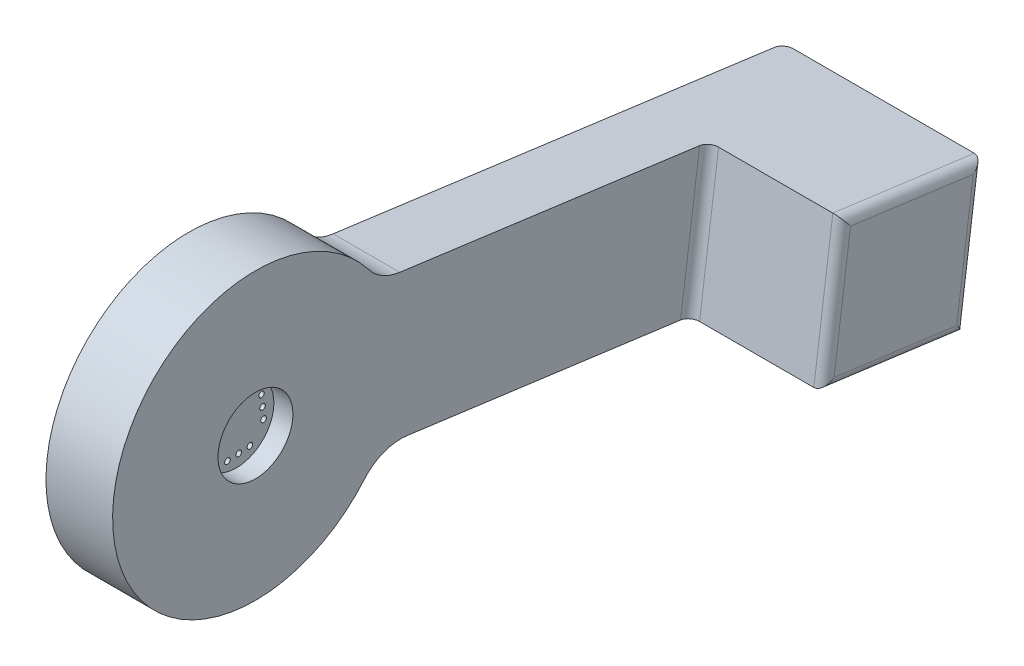
ISO-10303-21;
HEADER;
FILE_DESCRIPTION(('STEP AP214'),'2;1');
FILE_NAME('part.step','',(''),(''),'','','');
FILE_SCHEMA(('AUTOMOTIVE_DESIGN { 1 0 10303 214 1 1 1 1 }'));
ENDSEC;
DATA;
#1=APPLICATION_CONTEXT('core data for automotive mechanical design processes');
#2=APPLICATION_PROTOCOL_DEFINITION('international standard','automotive_design',2000,#1);
#3=PRODUCT_CONTEXT('',#1,'mechanical');
#4=PRODUCT('Part','Part','',(#3));
#5=PRODUCT_RELATED_PRODUCT_CATEGORY('part','',(#4));
#6=PRODUCT_DEFINITION_FORMATION('','',#4);
#7=PRODUCT_DEFINITION_CONTEXT('part definition',#1,'design');
#8=PRODUCT_DEFINITION('design','',#6,#7);
#9=PRODUCT_DEFINITION_SHAPE('','',#8);
#10=(LENGTH_UNIT() NAMED_UNIT(*) SI_UNIT(.MILLI.,.METRE.));
#11=(NAMED_UNIT(*) PLANE_ANGLE_UNIT() SI_UNIT($,.RADIAN.));
#12=(NAMED_UNIT(*) SI_UNIT($,.STERADIAN.) SOLID_ANGLE_UNIT());
#13=UNCERTAINTY_MEASURE_WITH_UNIT(LENGTH_MEASURE(1.E-05),#10,'distance_accuracy_value','');
#14=(GEOMETRIC_REPRESENTATION_CONTEXT(3) GLOBAL_UNCERTAINTY_ASSIGNED_CONTEXT((#13)) GLOBAL_UNIT_ASSIGNED_CONTEXT((#10,
#11,#12)) REPRESENTATION_CONTEXT('',''));
#15=CARTESIAN_POINT('',(0.,0.,0.));
#16=DIRECTION('',(0.,0.,1.));
#17=DIRECTION('',(1.,0.,0.));
#18=AXIS2_PLACEMENT_3D('',#15,#16,#17);
#19=CARTESIAN_POINT('',(17.78,-35.4166303814402,-153.708015152707));
#20=DIRECTION('',(0.,0.132873129837206,0.991133054320794));
#21=DIRECTION('',(0.,-0.991133054320794,0.132873129837206));
#22=AXIS2_PLACEMENT_3D('',#19,#20,#21);
#23=PLANE('',#22);
#24=DIRECTION('',(1.,0.,0.));
#25=VECTOR('',#24,1.);
#26=CARTESIAN_POINT('',(47.3438395307718,-6.59150776262857,-157.572364387763));
#27=LINE('',#26,#25);
#28=CARTESIAN_POINT('',(6.19583953077183,-6.59150776262856,-157.572364387763));
#29=VERTEX_POINT('',#28);
#30=CARTESIAN_POINT('',(47.3438395307718,-6.59150776262857,-157.572364387763));
#31=VERTEX_POINT('',#30);
#32=EDGE_CURVE('E190',#29,#31,#27,.T.);
#33=ORIENTED_EDGE('',*,*,#32,.F.);
#34=DIRECTION('',(0.,0.991133054320794,-0.132873129837205));
#35=VECTOR('',#34,1.);
#36=CARTESIAN_POINT('',(6.19583953077183,-26.4795836306296,-154.906132164449));
#37=LINE('',#36,#35);
#38=CARTESIAN_POINT('',(6.19583953077183,-26.4795836306296,-154.906132164449));
#39=VERTEX_POINT('',#38);
#40=EDGE_CURVE('E164',#39,#29,#37,.T.);
#41=ORIENTED_EDGE('',*,*,#40,.F.);
#42=DIRECTION('',(-1.,0.,0.));
#43=VECTOR('',#42,1.);
#44=CARTESIAN_POINT('',(47.3438395307718,-26.4795836306296,-154.906132164449));
#45=LINE('',#44,#43);
#46=CARTESIAN_POINT('',(47.3438395307718,-26.4795836306296,-154.906132164449));
#47=VERTEX_POINT('',#46);
#48=EDGE_CURVE('E181',#47,#39,#45,.T.);
#49=ORIENTED_EDGE('',*,*,#48,.F.);
#50=DIRECTION('',(0.,-0.991133054320794,0.132873129837205));
#51=VECTOR('',#50,1.);
#52=CARTESIAN_POINT('',(47.3438395307718,-26.4795836306296,-154.906132164449));
#53=LINE('',#52,#51);
#54=EDGE_CURVE('E184',#31,#47,#53,.T.);
#55=ORIENTED_EDGE('',*,*,#54,.F.);
#56=EDGE_LOOP('',(#33,#41,#49,#55));
#57=FACE_BOUND('',#56,.T.);
#58=DIRECTION('',(-1.,0.,0.));
#59=VECTOR('',#58,1.);
#60=CARTESIAN_POINT('',(17.78,-35.4166303814402,-153.708015152707));
#61=LINE('',#60,#59);
#62=CARTESIAN_POINT('',(50.8,-35.4166303814402,-153.708015152707));
#63=VERTEX_POINT('',#62);
#64=CARTESIAN_POINT('',(2.54,-35.4166303814402,-153.708015152707));
#65=VERTEX_POINT('',#64);
#66=EDGE_CURVE('E291',#63,#65,#61,.T.);
#67=ORIENTED_EDGE('',*,*,#66,.T.);
#68=DIRECTION('',(0.,0.991133054320794,-0.132873129837206));
#69=VECTOR('',#68,1.);
#70=CARTESIAN_POINT('',(2.54,-35.4166303814402,-153.708015152707));
#71=LINE('',#70,#69);
#72=CARTESIAN_POINT('',(2.54,2.34553898818202,-158.770481399505));
#73=VERTEX_POINT('',#72);
#74=EDGE_CURVE('E331',#65,#73,#71,.T.);
#75=ORIENTED_EDGE('',*,*,#74,.T.);
#76=DIRECTION('',(-1.,0.,0.));
#77=VECTOR('',#76,1.);
#78=CARTESIAN_POINT('',(17.78,2.34553898818202,-158.770481399505));
#79=LINE('',#78,#77);
#80=CARTESIAN_POINT('',(50.8,2.34553898818202,-158.770481399505));
#81=VERTEX_POINT('',#80);
#82=EDGE_CURVE('E299',#81,#73,#79,.T.);
#83=ORIENTED_EDGE('',*,*,#82,.F.);
#84=DIRECTION('',(0.,0.991133054320794,-0.132873129837206));
#85=VECTOR('',#84,1.);
#86=CARTESIAN_POINT('',(50.8,-35.4166303814402,-153.708015152707));
#87=LINE('',#86,#85);
#88=EDGE_CURVE('E322',#81,#63,#87,.F.);
#89=ORIENTED_EDGE('',*,*,#88,.T.);
#90=EDGE_LOOP('',(#67,#75,#83,#89));
#91=FACE_BOUND('',#90,.T.);
#92=ADVANCED_FACE('F44',(#57,#91),#23,.F.);
#93=CARTESIAN_POINT('',(17.78,2.34553898818202,-158.770481399505));
#94=DIRECTION('',(0.,-0.991133054320793,0.132873129837206));
#95=DIRECTION('',(0.,-0.132873129837206,-0.991133054320793));
#96=AXIS2_PLACEMENT_3D('',#93,#94,#95);
#97=PLANE('',#96);
#98=DIRECTION('',(0.,0.132873129837206,0.991133054320793));
#99=VECTOR('',#98,1.);
#100=CARTESIAN_POINT('',(0.,2.34553898818202,-158.770481399505));
#101=LINE('',#100,#99);
#102=CARTESIAN_POINT('',(0.,2.68303673796853,-156.25300344153));
#103=VERTEX_POINT('',#102);
#104=CARTESIAN_POINT('',(0.,18.4671894912832,-38.5151617317301));
#105=VERTEX_POINT('',#104);
#106=EDGE_CURVE('E280',#103,#105,#101,.T.);
#107=ORIENTED_EDGE('',*,*,#106,.T.);
#108=DIRECTION('',(1.,0.,0.));
#109=VECTOR('',#108,1.);
#110=CARTESIAN_POINT('',(17.78,18.4671894912832,-38.5151617317301));
#111=LINE('',#110,#109);
#112=CARTESIAN_POINT('',(17.78,18.4671894912832,-38.5151617317301));
#113=VERTEX_POINT('',#112);
#114=EDGE_CURVE('E59',#105,#113,#111,.T.);
#115=ORIENTED_EDGE('',*,*,#114,.T.);
#116=DIRECTION('',(0.,0.132873129837206,0.991133054320793));
#117=VECTOR('',#116,1.);
#118=CARTESIAN_POINT('',(17.78,2.34553898818202,-158.770481399505));
#119=LINE('',#118,#117);
#120=CARTESIAN_POINT('',(17.78,7.74550298476609,-118.490834071908));
#121=VERTEX_POINT('',#120);
#122=EDGE_CURVE('E283',#121,#113,#119,.T.);
#123=ORIENTED_EDGE('',*,*,#122,.F.);
#124=CARTESIAN_POINT('',(20.32,7.74550298476609,-118.490834071908));
#125=DIRECTION('',(0.,-0.991133054320793,0.132873129837206));
#126=DIRECTION('',(0.,-0.132873129837206,-0.991133054320793));
#127=AXIS2_PLACEMENT_3D('',#124,#125,#126);
#128=CIRCLE('',#127,2.54);
#129=CARTESIAN_POINT('',(20.32,7.40800523497956,-121.008312029883));
#130=VERTEX_POINT('',#129);
#131=EDGE_CURVE('E310',#121,#130,#128,.T.);
#132=ORIENTED_EDGE('',*,*,#131,.T.);
#133=DIRECTION('',(-1.,0.,0.));
#134=VECTOR('',#133,1.);
#135=CARTESIAN_POINT('',(53.34,7.40800523497956,-121.008312029883));
#136=LINE('',#135,#134);
#137=CARTESIAN_POINT('',(50.8,7.40800523497956,-121.008312029883));
#138=VERTEX_POINT('',#137);
#139=EDGE_CURVE('E202',#138,#130,#136,.T.);
#140=ORIENTED_EDGE('',*,*,#139,.F.);
#141=DIRECTION('',(0.,0.132873129837206,0.991133054320793));
#142=VECTOR('',#141,1.);
#143=CARTESIAN_POINT('',(50.8,2.34553898818202,-158.770481399505));
#144=LINE('',#143,#142);
#145=EDGE_CURVE('E329',#138,#81,#144,.F.);
#146=ORIENTED_EDGE('',*,*,#145,.T.);
#147=ORIENTED_EDGE('',*,*,#82,.T.);
#148=CARTESIAN_POINT('',(2.54,2.68303673796853,-156.25300344153));
#149=DIRECTION('',(0.,-0.991133054320793,0.132873129837206));
#150=DIRECTION('',(0.,-0.132873129837206,-0.991133054320793));
#151=AXIS2_PLACEMENT_3D('',#148,#149,#150);
#152=CIRCLE('',#151,2.54);
#153=EDGE_CURVE('E343',#73,#103,#152,.F.);
#154=ORIENTED_EDGE('',*,*,#153,.T.);
#155=EDGE_LOOP('',(#107,#115,#123,#132,#140,#146,#147,#154));
#156=FACE_BOUND('',#155,.T.);
#157=ADVANCED_FACE('F384',(#156),#97,.F.);
#158=CARTESIAN_POINT('',(17.78,0.,0.));
#159=DIRECTION('',(-1.,0.,0.));
#160=DIRECTION('',(0.,0.,1.));
#161=AXIS2_PLACEMENT_3D('',#158,#159,#160);
#162=CYLINDRICAL_SURFACE('',#161,38.1);
#163=CARTESIAN_POINT('',(0.,0.,0.));
#164=DIRECTION('',(1.,0.,0.));
#165=DIRECTION('',(0.,0.,-1.));
#166=AXIS2_PLACEMENT_3D('',#163,#164,#165);
#167=CIRCLE('',#166,38.1);
#168=CARTESIAN_POINT('',(0.,23.2909344608679,-30.1519878604969));
#169=VERTEX_POINT('',#168);
#170=CARTESIAN_POINT('',(0.,-24.6164097690644,-29.0799307097096));
#171=VERTEX_POINT('',#170);
#172=EDGE_CURVE('E293',#169,#171,#167,.T.);
#173=ORIENTED_EDGE('',*,*,#172,.T.);
#174=DIRECTION('',(-1.,0.,0.));
#175=VECTOR('',#174,1.);
#176=CARTESIAN_POINT('',(17.78,-24.6164097690644,-29.0799307097096));
#177=LINE('',#176,#175);
#178=CARTESIAN_POINT('',(17.78,-24.6164097690644,-29.0799307097096));
#179=VERTEX_POINT('',#178);
#180=EDGE_CURVE('E356',#171,#179,#177,.F.);
#181=ORIENTED_EDGE('',*,*,#180,.T.);
#182=CARTESIAN_POINT('',(17.78,0.,0.));
#183=DIRECTION('',(1.,0.,0.));
#184=DIRECTION('',(0.,0.,-1.));
#185=AXIS2_PLACEMENT_3D('',#182,#183,#184);
#186=CIRCLE('',#185,38.1);
#187=CARTESIAN_POINT('',(17.78,23.2909344608679,-30.1519878604969));
#188=VERTEX_POINT('',#187);
#189=EDGE_CURVE('E285',#188,#179,#186,.T.);
#190=ORIENTED_EDGE('',*,*,#189,.F.);
#191=DIRECTION('',(-1.,0.,0.));
#192=VECTOR('',#191,1.);
#193=CARTESIAN_POINT('',(17.78,23.2909344608679,-30.1519878604969));
#194=LINE('',#193,#192);
#195=EDGE_CURVE('E353',#188,#169,#194,.T.);
#196=ORIENTED_EDGE('',*,*,#195,.T.);
#197=EDGE_LOOP('',(#173,#181,#190,#196));
#198=FACE_BOUND('',#197,.T.);
#199=ADVANCED_FACE('F379',(#198),#162,.T.);
#200=CARTESIAN_POINT('',(17.78,-19.2204264775072,-32.896583500764));
#201=DIRECTION('',(0.,0.991133054320793,-0.132873129837206));
#202=DIRECTION('',(0.,0.132873129837206,0.991133054320794));
#203=AXIS2_PLACEMENT_3D('',#200,#201,#202);
#204=PLANE('',#203);
#205=DIRECTION('',(0.,-0.132873129837206,-0.991133054320793));
#206=VECTOR('',#205,1.);
#207=CARTESIAN_POINT('',(17.78,-19.2204264775072,-32.896583500764));
#208=LINE('',#207,#206);
#209=CARTESIAN_POINT('',(17.78,-20.2344899022118,-40.4607296952119));
#210=VERTEX_POINT('',#209);
#211=CARTESIAN_POINT('',(17.78,-30.0166663848561,-113.42836782511));
#212=VERTEX_POINT('',#211);
#213=EDGE_CURVE('E289',#210,#212,#208,.T.);
#214=ORIENTED_EDGE('',*,*,#213,.F.);
#215=DIRECTION('',(1.,0.,0.));
#216=VECTOR('',#215,1.);
#217=CARTESIAN_POINT('',(0.,-20.2344899022118,-40.4607296952119));
#218=LINE('',#217,#216);
#219=CARTESIAN_POINT('',(0.,-20.2344899022118,-40.4607296952119));
#220=VERTEX_POINT('',#219);
#221=EDGE_CURVE('E350',#210,#220,#218,.F.);
#222=ORIENTED_EDGE('',*,*,#221,.T.);
#223=DIRECTION('',(0.,-0.132873129837206,-0.991133054320793));
#224=VECTOR('',#223,1.);
#225=CARTESIAN_POINT('',(0.,-19.2204264775072,-32.896583500764));
#226=LINE('',#225,#224);
#227=CARTESIAN_POINT('',(0.,-35.0791326316537,-151.190537194732));
#228=VERTEX_POINT('',#227);
#229=EDGE_CURVE('E286',#220,#228,#226,.T.);
#230=ORIENTED_EDGE('',*,*,#229,.T.);
#231=CARTESIAN_POINT('',(2.54,-35.0791326316537,-151.190537194732));
#232=DIRECTION('',(0.,0.991133054320793,-0.132873129837206));
#233=DIRECTION('',(0.,0.132873129837206,0.991133054320794));
#234=AXIS2_PLACEMENT_3D('',#231,#232,#233);
#235=CIRCLE('',#234,2.54);
#236=EDGE_CURVE('E348',#228,#65,#235,.F.);
#237=ORIENTED_EDGE('',*,*,#236,.T.);
#238=ORIENTED_EDGE('',*,*,#66,.F.);
#239=DIRECTION('',(0.,-0.132873129837206,-0.991133054320794));
#240=VECTOR('',#239,1.);
#241=CARTESIAN_POINT('',(50.8,-30.3541641346426,-115.945845783085));
#242=LINE('',#241,#240);
#243=CARTESIAN_POINT('',(50.8,-30.3541641346427,-115.945845783085));
#244=VERTEX_POINT('',#243);
#245=EDGE_CURVE('E325',#63,#244,#242,.F.);
#246=ORIENTED_EDGE('',*,*,#245,.T.);
#247=DIRECTION('',(-1.,0.,0.));
#248=VECTOR('',#247,1.);
#249=CARTESIAN_POINT('',(53.34,-30.3541641346427,-115.945845783085));
#250=LINE('',#249,#248);
#251=CARTESIAN_POINT('',(20.32,-30.3541641346427,-115.945845783085));
#252=VERTEX_POINT('',#251);
#253=EDGE_CURVE('E197',#244,#252,#250,.T.);
#254=ORIENTED_EDGE('',*,*,#253,.T.);
#255=CARTESIAN_POINT('',(20.32,-30.0166663848561,-113.42836782511));
#256=DIRECTION('',(0.,0.991133054320793,-0.132873129837206));
#257=DIRECTION('',(0.,0.132873129837206,0.991133054320794));
#258=AXIS2_PLACEMENT_3D('',#255,#256,#257);
#259=CIRCLE('',#258,2.54);
#260=EDGE_CURVE('E307',#252,#212,#259,.T.);
#261=ORIENTED_EDGE('',*,*,#260,.T.);
#262=EDGE_LOOP('',(#214,#222,#230,#237,#238,#246,#254,#261));
#263=FACE_BOUND('',#262,.T.);
#264=ADVANCED_FACE('F372',(#263),#204,.F.);
#265=CARTESIAN_POINT('',(17.78,0.,0.));
#266=DIRECTION('',(1.,0.,0.));
#267=DIRECTION('',(0.,0.,-1.));
#268=AXIS2_PLACEMENT_3D('',#265,#266,#267);
#269=PLANE('',#268);
#270=ORIENTED_EDGE('',*,*,#189,.T.);
#271=CARTESIAN_POINT('',(17.78,-32.8218796920859,-38.7732409462794));
#272=DIRECTION('',(1.,0.,0.));
#273=DIRECTION('',(0.,0.,-1.));
#274=AXIS2_PLACEMENT_3D('',#271,#272,#273);
#275=CIRCLE('',#274,12.7);
#276=EDGE_CURVE('E361',#179,#210,#275,.F.);
#277=ORIENTED_EDGE('',*,*,#276,.T.);
#278=ORIENTED_EDGE('',*,*,#213,.T.);
#279=DIRECTION('',(0.,-0.991133054320794,0.132873129837206));
#280=VECTOR('',#279,1.);
#281=CARTESIAN_POINT('',(17.78,-15.4678956526637,-115.378802929704));
#282=LINE('',#281,#280);
#283=EDGE_CURVE('E305',#212,#121,#282,.F.);
#284=ORIENTED_EDGE('',*,*,#283,.T.);
#285=ORIENTED_EDGE('',*,*,#122,.T.);
#286=CARTESIAN_POINT('',(17.78,31.0545792811572,-40.2026504806626));
#287=DIRECTION('',(1.,0.,0.));
#288=DIRECTION('',(0.,0.,-1.));
#289=AXIS2_PLACEMENT_3D('',#286,#287,#288);
#290=CIRCLE('',#289,12.7);
#291=EDGE_CURVE('E11',#113,#188,#290,.F.);
#292=ORIENTED_EDGE('',*,*,#291,.T.);
#293=EDGE_LOOP('',(#270,#277,#278,#284,#285,#292));
#294=FACE_BOUND('',#293,.T.);
#295=CARTESIAN_POINT('',(17.78,0.,0.));
#296=DIRECTION('',(1.,0.,0.));
#297=DIRECTION('',(0.,0.,-1.));
#298=AXIS2_PLACEMENT_3D('',#295,#296,#297);
#299=CIRCLE('',#298,10.);
#300=CARTESIAN_POINT('',(17.78,0.,-10.));
#301=VERTEX_POINT('',#300);
#302=EDGE_CURVE('E274',#301,#301,#299,.T.);
#303=ORIENTED_EDGE('',*,*,#302,.F.);
#304=EDGE_LOOP('',(#303));
#305=FACE_BOUND('',#304,.T.);
#306=ADVANCED_FACE('F365',(#294,#305),#269,.T.);
#307=CARTESIAN_POINT('',(0.,0.,0.));
#308=DIRECTION('',(1.,0.,0.));
#309=DIRECTION('',(0.,0.,-1.));
#310=AXIS2_PLACEMENT_3D('',#307,#308,#309);
#311=PLANE('',#310);
#312=ORIENTED_EDGE('',*,*,#106,.F.);
#313=DIRECTION('',(0.,0.991133054320794,-0.132873129837206));
#314=VECTOR('',#313,1.);
#315=CARTESIAN_POINT('',(0.,-20.5303618994613,-153.140972299326));
#316=LINE('',#315,#314);
#317=EDGE_CURVE('E345',#103,#228,#316,.F.);
#318=ORIENTED_EDGE('',*,*,#317,.T.);
#319=ORIENTED_EDGE('',*,*,#229,.F.);
#320=CARTESIAN_POINT('',(0.,-32.8218796920859,-38.7732409462794));
#321=DIRECTION('',(1.,0.,0.));
#322=DIRECTION('',(0.,0.,-1.));
#323=AXIS2_PLACEMENT_3D('',#320,#321,#322);
#324=CIRCLE('',#323,12.7);
#325=EDGE_CURVE('E359',#220,#171,#324,.T.);
#326=ORIENTED_EDGE('',*,*,#325,.T.);
#327=ORIENTED_EDGE('',*,*,#172,.F.);
#328=CARTESIAN_POINT('',(0.,31.0545792811572,-40.2026504806626));
#329=DIRECTION('',(1.,0.,0.));
#330=DIRECTION('',(0.,0.,-1.));
#331=AXIS2_PLACEMENT_3D('',#328,#329,#330);
#332=CIRCLE('',#331,12.7);
#333=EDGE_CURVE('E52',#169,#105,#332,.T.);
#334=ORIENTED_EDGE('',*,*,#333,.T.);
#335=EDGE_LOOP('',(#312,#318,#319,#326,#327,#334));
#336=FACE_BOUND('',#335,.T.);
#337=ADVANCED_FACE('F377',(#336),#311,.F.);
#338=CARTESIAN_POINT('',(12.7,0.,0.));
#339=DIRECTION('',(1.,0.,0.));
#340=DIRECTION('',(0.,0.,-1.));
#341=AXIS2_PLACEMENT_3D('',#338,#339,#340);
#342=CYLINDRICAL_SURFACE('',#341,10.);
#343=CARTESIAN_POINT('',(12.7,0.,0.));
#344=DIRECTION('',(1.,0.,0.));
#345=DIRECTION('',(0.,0.,-1.));
#346=AXIS2_PLACEMENT_3D('',#343,#344,#345);
#347=CIRCLE('',#346,10.);
#348=CARTESIAN_POINT('',(12.7,0.,-10.));
#349=VERTEX_POINT('',#348);
#350=EDGE_CURVE('E277',#349,#349,#347,.T.);
#351=ORIENTED_EDGE('',*,*,#350,.F.);
#352=EDGE_LOOP('',(#351));
#353=FACE_BOUND('',#352,.T.);
#354=ORIENTED_EDGE('',*,*,#302,.T.);
#355=EDGE_LOOP('',(#354));
#356=FACE_BOUND('',#355,.T.);
#357=ADVANCED_FACE('F490',(#353,#356),#342,.F.);
#358=CARTESIAN_POINT('',(12.7,0.,0.));
#359=DIRECTION('',(1.,0.,0.));
#360=DIRECTION('',(0.,0.,-1.));
#361=AXIS2_PLACEMENT_3D('',#358,#359,#360);
#362=PLANE('',#361);
#363=CARTESIAN_POINT('',(12.7,6.70911759685105,3.60385086701065));
#364=DIRECTION('',(1.,0.,0.));
#365=DIRECTION('',(0.,0.,-1.));
#366=AXIS2_PLACEMENT_3D('',#363,#364,#365);
#367=CIRCLE('',#366,0.742534985704242);
#368=CARTESIAN_POINT('',(12.7,6.70911759685105,2.86131588130641));
#369=VERTEX_POINT('',#368);
#370=EDGE_CURVE('E266',#369,#369,#367,.T.);
#371=ORIENTED_EDGE('',*,*,#370,.F.);
#372=EDGE_LOOP('',(#371));
#373=FACE_BOUND('',#372,.T.);
#374=CARTESIAN_POINT('',(12.7,6.9728901802234,0.615469361201715));
#375=DIRECTION('',(1.,0.,0.));
#376=DIRECTION('',(0.,0.,-1.));
#377=AXIS2_PLACEMENT_3D('',#374,#375,#376);
#378=CIRCLE('',#377,0.749999999988268);
#379=CARTESIAN_POINT('',(12.7,6.9728901802234,-0.134530638786554));
#380=VERTEX_POINT('',#379);
#381=EDGE_CURVE('E260',#380,#380,#378,.T.);
#382=ORIENTED_EDGE('',*,*,#381,.F.);
#383=EDGE_LOOP('',(#382));
#384=FACE_BOUND('',#383,.T.);
#385=CARTESIAN_POINT('',(12.7,7.23666276359558,-2.37291214460722));
#386=DIRECTION('',(1.,0.,0.));
#387=DIRECTION('',(0.,0.,-1.));
#388=AXIS2_PLACEMENT_3D('',#385,#386,#387);
#389=CIRCLE('',#388,0.749999999988564);
#390=CARTESIAN_POINT('',(12.7,7.23666276359558,-3.12291214459578));
#391=VERTEX_POINT('',#390);
#392=EDGE_CURVE('E254',#391,#391,#389,.T.);
#393=ORIENTED_EDGE('',*,*,#392,.F.);
#394=EDGE_LOOP('',(#393));
#395=FACE_BOUND('',#394,.T.);
#396=CARTESIAN_POINT('',(12.7,3.60385086701315,-6.709117596849));
#397=DIRECTION('',(1.,0.,0.));
#398=DIRECTION('',(0.,0.,-1.));
#399=AXIS2_PLACEMENT_3D('',#396,#397,#398);
#400=CIRCLE('',#399,0.724827395509958);
#401=CARTESIAN_POINT('',(12.7,3.60385086701315,-7.43394499235896));
#402=VERTEX_POINT('',#401);
#403=EDGE_CURVE('E248',#402,#402,#400,.T.);
#404=ORIENTED_EDGE('',*,*,#403,.F.);
#405=EDGE_LOOP('',(#404));
#406=FACE_BOUND('',#405,.T.);
#407=CARTESIAN_POINT('',(12.7,0.615469361204268,-6.97289018022107));
#408=DIRECTION('',(1.,0.,0.));
#409=DIRECTION('',(0.,0.,-1.));
#410=AXIS2_PLACEMENT_3D('',#407,#408,#409);
#411=CIRCLE('',#410,0.749999999988269);
#412=CARTESIAN_POINT('',(12.7,0.615469361204268,-7.72289018020934));
#413=VERTEX_POINT('',#412);
#414=EDGE_CURVE('E242',#413,#413,#411,.T.);
#415=ORIENTED_EDGE('',*,*,#414,.F.);
#416=EDGE_LOOP('',(#415));
#417=FACE_BOUND('',#416,.T.);
#418=CARTESIAN_POINT('',(12.7,-2.37291214460478,-7.23666276359358));
#419=DIRECTION('',(1.,0.,0.));
#420=DIRECTION('',(0.,0.,-1.));
#421=AXIS2_PLACEMENT_3D('',#418,#419,#420);
#422=CIRCLE('',#421,0.74999999998832);
#423=CARTESIAN_POINT('',(12.7,-2.37291214460478,-7.9866627635819));
#424=VERTEX_POINT('',#423);
#425=EDGE_CURVE('E236',#424,#424,#422,.T.);
#426=ORIENTED_EDGE('',*,*,#425,.F.);
#427=EDGE_LOOP('',(#426));
#428=FACE_BOUND('',#427,.T.);
#429=CARTESIAN_POINT('',(12.7,-6.70911759684623,-3.60385086701109));
#430=DIRECTION('',(1.,0.,0.));
#431=DIRECTION('',(0.,0.,-1.));
#432=AXIS2_PLACEMENT_3D('',#429,#430,#431);
#433=CIRCLE('',#432,0.749999999988367);
#434=CARTESIAN_POINT('',(12.7,-6.70911759684623,-4.35385086699946));
#435=VERTEX_POINT('',#434);
#436=EDGE_CURVE('E230',#435,#435,#433,.T.);
#437=ORIENTED_EDGE('',*,*,#436,.F.);
#438=EDGE_LOOP('',(#437));
#439=FACE_BOUND('',#438,.T.);
#440=CARTESIAN_POINT('',(12.7,-6.97289018021857,-0.615469361202159));
#441=DIRECTION('',(1.,0.,0.));
#442=DIRECTION('',(0.,0.,-1.));
#443=AXIS2_PLACEMENT_3D('',#440,#441,#442);
#444=CIRCLE('',#443,0.749999999988239);
#445=CARTESIAN_POINT('',(12.7,-6.97289018021857,-1.3654693611904));
#446=VERTEX_POINT('',#445);
#447=EDGE_CURVE('E224',#446,#446,#444,.T.);
#448=ORIENTED_EDGE('',*,*,#447,.F.);
#449=EDGE_LOOP('',(#448));
#450=FACE_BOUND('',#449,.T.);
#451=CARTESIAN_POINT('',(12.7,-7.23666276359081,2.372912144607));
#452=DIRECTION('',(1.,0.,0.));
#453=DIRECTION('',(0.,0.,-1.));
#454=AXIS2_PLACEMENT_3D('',#451,#452,#453);
#455=CIRCLE('',#454,0.749999999988283);
#456=CARTESIAN_POINT('',(12.7,-7.23666276359081,1.62291214461871));
#457=VERTEX_POINT('',#456);
#458=EDGE_CURVE('E218',#457,#457,#455,.T.);
#459=ORIENTED_EDGE('',*,*,#458,.F.);
#460=EDGE_LOOP('',(#459));
#461=FACE_BOUND('',#460,.T.);
#462=CARTESIAN_POINT('',(12.7,-3.6038508670086,6.70911759684878));
#463=DIRECTION('',(1.,0.,0.));
#464=DIRECTION('',(0.,0.,-1.));
#465=AXIS2_PLACEMENT_3D('',#462,#463,#464);
#466=CIRCLE('',#465,0.750000000000138);
#467=CARTESIAN_POINT('',(12.7,-3.6038508670086,5.95911759684864));
#468=VERTEX_POINT('',#467);
#469=EDGE_CURVE('E212',#468,#468,#466,.T.);
#470=ORIENTED_EDGE('',*,*,#469,.F.);
#471=EDGE_LOOP('',(#470));
#472=FACE_BOUND('',#471,.T.);
#473=CARTESIAN_POINT('',(12.7,-0.615469361199605,6.97289018022063));
#474=DIRECTION('',(1.,0.,0.));
#475=DIRECTION('',(0.,0.,-1.));
#476=AXIS2_PLACEMENT_3D('',#473,#474,#475);
#477=CIRCLE('',#476,0.749999999988334);
#478=CARTESIAN_POINT('',(12.7,-0.615469361199605,6.22289018023229));
#479=VERTEX_POINT('',#478);
#480=EDGE_CURVE('E205',#479,#479,#477,.T.);
#481=ORIENTED_EDGE('',*,*,#480,.F.);
#482=EDGE_LOOP('',(#481));
#483=FACE_BOUND('',#482,.T.);
#484=CARTESIAN_POINT('',(12.7,2.37291214460944,7.23666276359314));
#485=DIRECTION('',(1.,0.,0.));
#486=DIRECTION('',(0.,0.,-1.));
#487=AXIS2_PLACEMENT_3D('',#484,#485,#486);
#488=CIRCLE('',#487,0.749999999988565);
#489=CARTESIAN_POINT('',(12.7,2.37291214460944,6.48666276360457));
#490=VERTEX_POINT('',#489);
#491=EDGE_CURVE('E208',#490,#490,#488,.T.);
#492=ORIENTED_EDGE('',*,*,#491,.F.);
#493=EDGE_LOOP('',(#492));
#494=FACE_BOUND('',#493,.T.);
#495=ORIENTED_EDGE('',*,*,#350,.T.);
#496=EDGE_LOOP('',(#495));
#497=FACE_BOUND('',#496,.T.);
#498=ADVANCED_FACE('F769',(#373,#384,#395,#406,#417,#428,#439,#450,#461,#472,#483,#494,#497),
#362,.T.);
#499=CARTESIAN_POINT('',(7.62,2.37291214460944,7.23666276359314));
#500=DIRECTION('',(1.,0.,0.));
#501=DIRECTION('',(0.,0.,-1.));
#502=AXIS2_PLACEMENT_3D('',#499,#500,#501);
#503=CYLINDRICAL_SURFACE('',#502,0.749999999988565);
#504=CARTESIAN_POINT('',(7.62,2.37291214460944,7.23666276359314));
#505=DIRECTION('',(1.,0.,0.));
#506=DIRECTION('',(0.,0.,-1.));
#507=AXIS2_PLACEMENT_3D('',#504,#505,#506);
#508=CIRCLE('',#507,0.749999999988565);
#509=CARTESIAN_POINT('',(7.62,2.37291214460944,6.48666276360457));
#510=VERTEX_POINT('',#509);
#511=EDGE_CURVE('E271',#510,#510,#508,.T.);
#512=ORIENTED_EDGE('',*,*,#511,.F.);
#513=EDGE_LOOP('',(#512));
#514=FACE_BOUND('',#513,.T.);
#515=ORIENTED_EDGE('',*,*,#491,.T.);
#516=EDGE_LOOP('',(#515));
#517=FACE_BOUND('',#516,.T.);
#518=ADVANCED_FACE('F759',(#514,#517),#503,.F.);
#519=CARTESIAN_POINT('',(7.62,2.37291214460944,7.23666276359314));
#520=DIRECTION('',(1.,0.,0.));
#521=DIRECTION('',(0.,0.,-1.));
#522=AXIS2_PLACEMENT_3D('',#519,#520,#521);
#523=PLANE('',#522);
#524=ORIENTED_EDGE('',*,*,#511,.T.);
#525=EDGE_LOOP('',(#524));
#526=FACE_BOUND('',#525,.T.);
#527=ADVANCED_FACE('F749',(#526),#523,.T.);
#528=CARTESIAN_POINT('',(7.62,-0.615469361199605,6.97289018022063));
#529=DIRECTION('',(1.,0.,0.));
#530=DIRECTION('',(0.,0.,-1.));
#531=AXIS2_PLACEMENT_3D('',#528,#529,#530);
#532=CYLINDRICAL_SURFACE('',#531,0.749999999988334);
#533=CARTESIAN_POINT('',(7.62,-0.615469361199605,6.97289018022063));
#534=DIRECTION('',(1.,0.,0.));
#535=DIRECTION('',(0.,0.,-1.));
#536=AXIS2_PLACEMENT_3D('',#533,#534,#535);
#537=CIRCLE('',#536,0.749999999988334);
#538=CARTESIAN_POINT('',(7.62,-0.615469361199605,6.22289018023229));
#539=VERTEX_POINT('',#538);
#540=EDGE_CURVE('E209',#539,#539,#537,.T.);
#541=ORIENTED_EDGE('',*,*,#540,.F.);
#542=EDGE_LOOP('',(#541));
#543=FACE_BOUND('',#542,.T.);
#544=ORIENTED_EDGE('',*,*,#480,.T.);
#545=EDGE_LOOP('',(#544));
#546=FACE_BOUND('',#545,.T.);
#547=ADVANCED_FACE('F739',(#543,#546),#532,.F.);
#548=CARTESIAN_POINT('',(7.62,-0.615469361199605,6.97289018022063));
#549=DIRECTION('',(1.,0.,0.));
#550=DIRECTION('',(0.,0.,-1.));
#551=AXIS2_PLACEMENT_3D('',#548,#549,#550);
#552=PLANE('',#551);
#553=ORIENTED_EDGE('',*,*,#540,.T.);
#554=EDGE_LOOP('',(#553));
#555=FACE_BOUND('',#554,.T.);
#556=ADVANCED_FACE('F729',(#555),#552,.T.);
#557=CARTESIAN_POINT('',(7.62,-3.6038508670086,6.70911759684878));
#558=DIRECTION('',(1.,0.,0.));
#559=DIRECTION('',(0.,0.,-1.));
#560=AXIS2_PLACEMENT_3D('',#557,#558,#559);
#561=CYLINDRICAL_SURFACE('',#560,0.750000000000138);
#562=CARTESIAN_POINT('',(7.62,-3.6038508670086,6.70911759684878));
#563=DIRECTION('',(1.,0.,0.));
#564=DIRECTION('',(0.,0.,-1.));
#565=AXIS2_PLACEMENT_3D('',#562,#563,#564);
#566=CIRCLE('',#565,0.750000000000138);
#567=CARTESIAN_POINT('',(7.62,-3.6038508670086,5.95911759684864));
#568=VERTEX_POINT('',#567);
#569=EDGE_CURVE('E215',#568,#568,#566,.T.);
#570=ORIENTED_EDGE('',*,*,#569,.F.);
#571=EDGE_LOOP('',(#570));
#572=FACE_BOUND('',#571,.T.);
#573=ORIENTED_EDGE('',*,*,#469,.T.);
#574=EDGE_LOOP('',(#573));
#575=FACE_BOUND('',#574,.T.);
#576=ADVANCED_FACE('F719',(#572,#575),#561,.F.);
#577=CARTESIAN_POINT('',(7.62,-3.6038508670086,6.70911759684878));
#578=DIRECTION('',(1.,0.,0.));
#579=DIRECTION('',(0.,0.,-1.));
#580=AXIS2_PLACEMENT_3D('',#577,#578,#579);
#581=PLANE('',#580);
#582=ORIENTED_EDGE('',*,*,#569,.T.);
#583=EDGE_LOOP('',(#582));
#584=FACE_BOUND('',#583,.T.);
#585=ADVANCED_FACE('F709',(#584),#581,.T.);
#586=CARTESIAN_POINT('',(7.62,-7.23666276359081,2.372912144607));
#587=DIRECTION('',(1.,0.,0.));
#588=DIRECTION('',(0.,0.,-1.));
#589=AXIS2_PLACEMENT_3D('',#586,#587,#588);
#590=CYLINDRICAL_SURFACE('',#589,0.749999999988283);
#591=CARTESIAN_POINT('',(7.62,-7.23666276359081,2.372912144607));
#592=DIRECTION('',(1.,0.,0.));
#593=DIRECTION('',(0.,0.,-1.));
#594=AXIS2_PLACEMENT_3D('',#591,#592,#593);
#595=CIRCLE('',#594,0.749999999988283);
#596=CARTESIAN_POINT('',(7.62,-7.23666276359081,1.62291214461871));
#597=VERTEX_POINT('',#596);
#598=EDGE_CURVE('E221',#597,#597,#595,.T.);
#599=ORIENTED_EDGE('',*,*,#598,.F.);
#600=EDGE_LOOP('',(#599));
#601=FACE_BOUND('',#600,.T.);
#602=ORIENTED_EDGE('',*,*,#458,.T.);
#603=EDGE_LOOP('',(#602));
#604=FACE_BOUND('',#603,.T.);
#605=ADVANCED_FACE('F699',(#601,#604),#590,.F.);
#606=CARTESIAN_POINT('',(7.62,-7.23666276359081,2.372912144607));
#607=DIRECTION('',(1.,0.,0.));
#608=DIRECTION('',(0.,0.,-1.));
#609=AXIS2_PLACEMENT_3D('',#606,#607,#608);
#610=PLANE('',#609);
#611=ORIENTED_EDGE('',*,*,#598,.T.);
#612=EDGE_LOOP('',(#611));
#613=FACE_BOUND('',#612,.T.);
#614=ADVANCED_FACE('F689',(#613),#610,.T.);
#615=CARTESIAN_POINT('',(7.62,-6.97289018021857,-0.615469361202159));
#616=DIRECTION('',(1.,0.,0.));
#617=DIRECTION('',(0.,0.,-1.));
#618=AXIS2_PLACEMENT_3D('',#615,#616,#617);
#619=CYLINDRICAL_SURFACE('',#618,0.749999999988239);
#620=CARTESIAN_POINT('',(7.62,-6.97289018021857,-0.615469361202159));
#621=DIRECTION('',(1.,0.,0.));
#622=DIRECTION('',(0.,0.,-1.));
#623=AXIS2_PLACEMENT_3D('',#620,#621,#622);
#624=CIRCLE('',#623,0.749999999988239);
#625=CARTESIAN_POINT('',(7.62,-6.97289018021857,-1.3654693611904));
#626=VERTEX_POINT('',#625);
#627=EDGE_CURVE('E227',#626,#626,#624,.T.);
#628=ORIENTED_EDGE('',*,*,#627,.F.);
#629=EDGE_LOOP('',(#628));
#630=FACE_BOUND('',#629,.T.);
#631=ORIENTED_EDGE('',*,*,#447,.T.);
#632=EDGE_LOOP('',(#631));
#633=FACE_BOUND('',#632,.T.);
#634=ADVANCED_FACE('F679',(#630,#633),#619,.F.);
#635=CARTESIAN_POINT('',(7.62,-6.97289018021857,-0.615469361202159));
#636=DIRECTION('',(1.,0.,0.));
#637=DIRECTION('',(0.,0.,-1.));
#638=AXIS2_PLACEMENT_3D('',#635,#636,#637);
#639=PLANE('',#638);
#640=ORIENTED_EDGE('',*,*,#627,.T.);
#641=EDGE_LOOP('',(#640));
#642=FACE_BOUND('',#641,.T.);
#643=ADVANCED_FACE('F669',(#642),#639,.T.);
#644=CARTESIAN_POINT('',(7.62,-6.70911759684623,-3.60385086701109));
#645=DIRECTION('',(1.,0.,0.));
#646=DIRECTION('',(0.,0.,-1.));
#647=AXIS2_PLACEMENT_3D('',#644,#645,#646);
#648=CYLINDRICAL_SURFACE('',#647,0.749999999988367);
#649=CARTESIAN_POINT('',(7.62,-6.70911759684623,-3.60385086701109));
#650=DIRECTION('',(1.,0.,0.));
#651=DIRECTION('',(0.,0.,-1.));
#652=AXIS2_PLACEMENT_3D('',#649,#650,#651);
#653=CIRCLE('',#652,0.749999999988367);
#654=CARTESIAN_POINT('',(7.62,-6.70911759684623,-4.35385086699946));
#655=VERTEX_POINT('',#654);
#656=EDGE_CURVE('E233',#655,#655,#653,.T.);
#657=ORIENTED_EDGE('',*,*,#656,.F.);
#658=EDGE_LOOP('',(#657));
#659=FACE_BOUND('',#658,.T.);
#660=ORIENTED_EDGE('',*,*,#436,.T.);
#661=EDGE_LOOP('',(#660));
#662=FACE_BOUND('',#661,.T.);
#663=ADVANCED_FACE('F659',(#659,#662),#648,.F.);
#664=CARTESIAN_POINT('',(7.62,-6.70911759684623,-3.60385086701109));
#665=DIRECTION('',(1.,0.,0.));
#666=DIRECTION('',(0.,0.,-1.));
#667=AXIS2_PLACEMENT_3D('',#664,#665,#666);
#668=PLANE('',#667);
#669=ORIENTED_EDGE('',*,*,#656,.T.);
#670=EDGE_LOOP('',(#669));
#671=FACE_BOUND('',#670,.T.);
#672=ADVANCED_FACE('F649',(#671),#668,.T.);
#673=CARTESIAN_POINT('',(7.62,-2.37291214460478,-7.23666276359358));
#674=DIRECTION('',(1.,0.,0.));
#675=DIRECTION('',(0.,0.,-1.));
#676=AXIS2_PLACEMENT_3D('',#673,#674,#675);
#677=CYLINDRICAL_SURFACE('',#676,0.74999999998832);
#678=CARTESIAN_POINT('',(7.62,-2.37291214460478,-7.23666276359358));
#679=DIRECTION('',(1.,0.,0.));
#680=DIRECTION('',(0.,0.,-1.));
#681=AXIS2_PLACEMENT_3D('',#678,#679,#680);
#682=CIRCLE('',#681,0.74999999998832);
#683=CARTESIAN_POINT('',(7.62,-2.37291214460478,-7.9866627635819));
#684=VERTEX_POINT('',#683);
#685=EDGE_CURVE('E239',#684,#684,#682,.T.);
#686=ORIENTED_EDGE('',*,*,#685,.F.);
#687=EDGE_LOOP('',(#686));
#688=FACE_BOUND('',#687,.T.);
#689=ORIENTED_EDGE('',*,*,#425,.T.);
#690=EDGE_LOOP('',(#689));
#691=FACE_BOUND('',#690,.T.);
#692=ADVANCED_FACE('F639',(#688,#691),#677,.F.);
#693=CARTESIAN_POINT('',(7.62,-2.37291214460478,-7.23666276359358));
#694=DIRECTION('',(1.,0.,0.));
#695=DIRECTION('',(0.,0.,-1.));
#696=AXIS2_PLACEMENT_3D('',#693,#694,#695);
#697=PLANE('',#696);
#698=ORIENTED_EDGE('',*,*,#685,.T.);
#699=EDGE_LOOP('',(#698));
#700=FACE_BOUND('',#699,.T.);
#701=ADVANCED_FACE('F629',(#700),#697,.T.);
#702=CARTESIAN_POINT('',(7.62,0.615469361204268,-6.97289018022107));
#703=DIRECTION('',(1.,0.,0.));
#704=DIRECTION('',(0.,0.,-1.));
#705=AXIS2_PLACEMENT_3D('',#702,#703,#704);
#706=CYLINDRICAL_SURFACE('',#705,0.749999999988269);
#707=CARTESIAN_POINT('',(7.62,0.615469361204268,-6.97289018022107));
#708=DIRECTION('',(1.,0.,0.));
#709=DIRECTION('',(0.,0.,-1.));
#710=AXIS2_PLACEMENT_3D('',#707,#708,#709);
#711=CIRCLE('',#710,0.749999999988269);
#712=CARTESIAN_POINT('',(7.62,0.615469361204268,-7.72289018020934));
#713=VERTEX_POINT('',#712);
#714=EDGE_CURVE('E245',#713,#713,#711,.T.);
#715=ORIENTED_EDGE('',*,*,#714,.F.);
#716=EDGE_LOOP('',(#715));
#717=FACE_BOUND('',#716,.T.);
#718=ORIENTED_EDGE('',*,*,#414,.T.);
#719=EDGE_LOOP('',(#718));
#720=FACE_BOUND('',#719,.T.);
#721=ADVANCED_FACE('F619',(#717,#720),#706,.F.);
#722=CARTESIAN_POINT('',(7.62,0.615469361204268,-6.97289018022107));
#723=DIRECTION('',(1.,0.,0.));
#724=DIRECTION('',(0.,0.,-1.));
#725=AXIS2_PLACEMENT_3D('',#722,#723,#724);
#726=PLANE('',#725);
#727=ORIENTED_EDGE('',*,*,#714,.T.);
#728=EDGE_LOOP('',(#727));
#729=FACE_BOUND('',#728,.T.);
#730=ADVANCED_FACE('F609',(#729),#726,.T.);
#731=CARTESIAN_POINT('',(7.62,3.60385086701315,-6.709117596849));
#732=DIRECTION('',(1.,0.,0.));
#733=DIRECTION('',(0.,0.,-1.));
#734=AXIS2_PLACEMENT_3D('',#731,#732,#733);
#735=CYLINDRICAL_SURFACE('',#734,0.724827395509958);
#736=CARTESIAN_POINT('',(7.62,3.60385086701315,-6.709117596849));
#737=DIRECTION('',(1.,0.,0.));
#738=DIRECTION('',(0.,0.,-1.));
#739=AXIS2_PLACEMENT_3D('',#736,#737,#738);
#740=CIRCLE('',#739,0.724827395509958);
#741=CARTESIAN_POINT('',(7.62,3.60385086701315,-7.43394499235896));
#742=VERTEX_POINT('',#741);
#743=EDGE_CURVE('E251',#742,#742,#740,.T.);
#744=ORIENTED_EDGE('',*,*,#743,.F.);
#745=EDGE_LOOP('',(#744));
#746=FACE_BOUND('',#745,.T.);
#747=ORIENTED_EDGE('',*,*,#403,.T.);
#748=EDGE_LOOP('',(#747));
#749=FACE_BOUND('',#748,.T.);
#750=ADVANCED_FACE('F599',(#746,#749),#735,.F.);
#751=CARTESIAN_POINT('',(7.62,3.60385086701315,-6.709117596849));
#752=DIRECTION('',(1.,0.,0.));
#753=DIRECTION('',(0.,0.,-1.));
#754=AXIS2_PLACEMENT_3D('',#751,#752,#753);
#755=PLANE('',#754);
#756=ORIENTED_EDGE('',*,*,#743,.T.);
#757=EDGE_LOOP('',(#756));
#758=FACE_BOUND('',#757,.T.);
#759=ADVANCED_FACE('F589',(#758),#755,.T.);
#760=CARTESIAN_POINT('',(7.62,7.23666276359558,-2.37291214460722));
#761=DIRECTION('',(1.,0.,0.));
#762=DIRECTION('',(0.,0.,-1.));
#763=AXIS2_PLACEMENT_3D('',#760,#761,#762);
#764=CYLINDRICAL_SURFACE('',#763,0.749999999988564);
#765=CARTESIAN_POINT('',(7.62,7.23666276359558,-2.37291214460722));
#766=DIRECTION('',(1.,0.,0.));
#767=DIRECTION('',(0.,0.,-1.));
#768=AXIS2_PLACEMENT_3D('',#765,#766,#767);
#769=CIRCLE('',#768,0.749999999988564);
#770=CARTESIAN_POINT('',(7.62,7.23666276359558,-3.12291214459578));
#771=VERTEX_POINT('',#770);
#772=EDGE_CURVE('E257',#771,#771,#769,.T.);
#773=ORIENTED_EDGE('',*,*,#772,.F.);
#774=EDGE_LOOP('',(#773));
#775=FACE_BOUND('',#774,.T.);
#776=ORIENTED_EDGE('',*,*,#392,.T.);
#777=EDGE_LOOP('',(#776));
#778=FACE_BOUND('',#777,.T.);
#779=ADVANCED_FACE('F579',(#775,#778),#764,.F.);
#780=CARTESIAN_POINT('',(7.62,7.23666276359558,-2.37291214460722));
#781=DIRECTION('',(1.,0.,0.));
#782=DIRECTION('',(0.,0.,-1.));
#783=AXIS2_PLACEMENT_3D('',#780,#781,#782);
#784=PLANE('',#783);
#785=ORIENTED_EDGE('',*,*,#772,.T.);
#786=EDGE_LOOP('',(#785));
#787=FACE_BOUND('',#786,.T.);
#788=ADVANCED_FACE('F569',(#787),#784,.T.);
#789=CARTESIAN_POINT('',(7.62,6.9728901802234,0.615469361201715));
#790=DIRECTION('',(1.,0.,0.));
#791=DIRECTION('',(0.,0.,-1.));
#792=AXIS2_PLACEMENT_3D('',#789,#790,#791);
#793=CYLINDRICAL_SURFACE('',#792,0.749999999988268);
#794=CARTESIAN_POINT('',(7.62,6.9728901802234,0.615469361201715));
#795=DIRECTION('',(1.,0.,0.));
#796=DIRECTION('',(0.,0.,-1.));
#797=AXIS2_PLACEMENT_3D('',#794,#795,#796);
#798=CIRCLE('',#797,0.749999999988268);
#799=CARTESIAN_POINT('',(7.62,6.9728901802234,-0.134530638786554));
#800=VERTEX_POINT('',#799);
#801=EDGE_CURVE('E263',#800,#800,#798,.T.);
#802=ORIENTED_EDGE('',*,*,#801,.F.);
#803=EDGE_LOOP('',(#802));
#804=FACE_BOUND('',#803,.T.);
#805=ORIENTED_EDGE('',*,*,#381,.T.);
#806=EDGE_LOOP('',(#805));
#807=FACE_BOUND('',#806,.T.);
#808=ADVANCED_FACE('F559',(#804,#807),#793,.F.);
#809=CARTESIAN_POINT('',(7.62,6.9728901802234,0.615469361201715));
#810=DIRECTION('',(1.,0.,0.));
#811=DIRECTION('',(0.,0.,-1.));
#812=AXIS2_PLACEMENT_3D('',#809,#810,#811);
#813=PLANE('',#812);
#814=ORIENTED_EDGE('',*,*,#801,.T.);
#815=EDGE_LOOP('',(#814));
#816=FACE_BOUND('',#815,.T.);
#817=ADVANCED_FACE('F549',(#816),#813,.T.);
#818=CARTESIAN_POINT('',(7.62,6.70911759685105,3.60385086701065));
#819=DIRECTION('',(1.,0.,0.));
#820=DIRECTION('',(0.,0.,-1.));
#821=AXIS2_PLACEMENT_3D('',#818,#819,#820);
#822=CYLINDRICAL_SURFACE('',#821,0.742534985704242);
#823=CARTESIAN_POINT('',(7.62,6.70911759685105,3.60385086701065));
#824=DIRECTION('',(1.,0.,0.));
#825=DIRECTION('',(0.,0.,-1.));
#826=AXIS2_PLACEMENT_3D('',#823,#824,#825);
#827=CIRCLE('',#826,0.742534985704242);
#828=CARTESIAN_POINT('',(7.62,6.70911759685105,2.86131588130641));
#829=VERTEX_POINT('',#828);
#830=EDGE_CURVE('E204',#829,#829,#827,.T.);
#831=ORIENTED_EDGE('',*,*,#830,.F.);
#832=EDGE_LOOP('',(#831));
#833=FACE_BOUND('',#832,.T.);
#834=ORIENTED_EDGE('',*,*,#370,.T.);
#835=EDGE_LOOP('',(#834));
#836=FACE_BOUND('',#835,.T.);
#837=ADVANCED_FACE('F537',(#833,#836),#822,.F.);
#838=CARTESIAN_POINT('',(7.62,6.70911759685105,3.60385086701065));
#839=DIRECTION('',(1.,0.,0.));
#840=DIRECTION('',(0.,0.,-1.));
#841=AXIS2_PLACEMENT_3D('',#838,#839,#840);
#842=PLANE('',#841);
#843=ORIENTED_EDGE('',*,*,#830,.T.);
#844=EDGE_LOOP('',(#843));
#845=FACE_BOUND('',#844,.T.);
#846=ADVANCED_FACE('F531',(#845),#842,.T.);
#847=CARTESIAN_POINT('',(53.34,7.40800523497956,-121.008312029883));
#848=DIRECTION('',(0.,-0.132873129837206,-0.991133054320794));
#849=DIRECTION('',(0.,0.991133054320794,-0.132873129837206));
#850=AXIS2_PLACEMENT_3D('',#847,#848,#849);
#851=PLANE('',#850);
#852=ORIENTED_EDGE('',*,*,#253,.F.);
#853=DIRECTION('',(0.,-0.991133054320794,0.132873129837206));
#854=VECTOR('',#853,1.);
#855=CARTESIAN_POINT('',(50.8,7.40800523497956,-121.008312029883));
#856=LINE('',#855,#854);
#857=EDGE_CURVE('E327',#244,#138,#856,.F.);
#858=ORIENTED_EDGE('',*,*,#857,.T.);
#859=ORIENTED_EDGE('',*,*,#139,.T.);
#860=DIRECTION('',(0.,-0.991133054320794,0.132873129837206));
#861=VECTOR('',#860,1.);
#862=CARTESIAN_POINT('',(20.32,7.40800523497956,-121.008312029883));
#863=LINE('',#862,#861);
#864=EDGE_CURVE('E302',#130,#252,#863,.T.);
#865=ORIENTED_EDGE('',*,*,#864,.T.);
#866=EDGE_LOOP('',(#852,#858,#859,#865));
#867=FACE_BOUND('',#866,.T.);
#868=ADVANCED_FACE('F391',(#867),#851,.F.);
#869=CARTESIAN_POINT('',(53.34,0.,0.));
#870=DIRECTION('',(1.,0.,0.));
#871=DIRECTION('',(0.,0.,-1.));
#872=AXIS2_PLACEMENT_3D('',#869,#870,#871);
#873=PLANE('',#872);
#874=DIRECTION('',(0.,-0.132873129837206,-0.991133054320794));
#875=VECTOR('',#874,1.);
#876=CARTESIAN_POINT('',(53.34,-32.8991524234654,-154.045512902494));
#877=LINE('',#876,#875);
#878=CARTESIAN_POINT('',(53.34,-28.1741839264543,-118.800821490846));
#879=VERTEX_POINT('',#878);
#880=CARTESIAN_POINT('',(53.34,-32.5616546736789,-151.528034944519));
#881=VERTEX_POINT('',#880);
#882=EDGE_CURVE('E317',#879,#881,#877,.T.);
#883=ORIENTED_EDGE('',*,*,#882,.T.);
#884=DIRECTION('',(0.,0.991133054320794,-0.132873129837206));
#885=VECTOR('',#884,1.);
#886=CARTESIAN_POINT('',(53.34,2.68303673796853,-156.25300344153));
#887=LINE('',#886,#885);
#888=CARTESIAN_POINT('',(53.34,0.165558779993715,-155.915505691743));
#889=VERTEX_POINT('',#888);
#890=EDGE_CURVE('E319',#881,#889,#887,.T.);
#891=ORIENTED_EDGE('',*,*,#890,.T.);
#892=DIRECTION('',(0.,0.132873129837206,0.991133054320793));
#893=VECTOR('',#892,1.);
#894=CARTESIAN_POINT('',(53.34,4.89052727700477,-120.670814280096));
#895=LINE('',#894,#893);
#896=CARTESIAN_POINT('',(53.34,4.55302952721827,-123.188292238071));
#897=VERTEX_POINT('',#896);
#898=EDGE_CURVE('E313',#889,#897,#895,.T.);
#899=ORIENTED_EDGE('',*,*,#898,.T.);
#900=DIRECTION('',(0.,-0.991133054320794,0.132873129837206));
#901=VECTOR('',#900,1.);
#902=CARTESIAN_POINT('',(53.34,-30.6916618844292,-118.46332374106));
#903=LINE('',#902,#901);
#904=EDGE_CURVE('E315',#897,#879,#903,.T.);
#905=ORIENTED_EDGE('',*,*,#904,.T.);
#906=EDGE_LOOP('',(#883,#891,#899,#905));
#907=FACE_BOUND('',#906,.T.);
#908=ADVANCED_FACE('F450',(#907),#873,.T.);
#909=CARTESIAN_POINT('',(6.19583953077183,-22.918982370382,-128.346739707815));
#910=DIRECTION('',(-1.,0.,0.));
#911=DIRECTION('',(0.,0.,1.));
#912=AXIS2_PLACEMENT_3D('',#909,#910,#911);
#913=PLANE('',#912);
#914=ORIENTED_EDGE('',*,*,#40,.T.);
#915=DIRECTION('',(0.,-0.132873129837206,-0.991133054320793));
#916=VECTOR('',#915,1.);
#917=CARTESIAN_POINT('',(6.19583953077183,-3.03090650238096,-131.012971931128));
#918=LINE('',#917,#916);
#919=CARTESIAN_POINT('',(6.19583953077183,-3.03090650238096,-131.012971931128));
#920=VERTEX_POINT('',#919);
#921=EDGE_CURVE('E157',#920,#29,#918,.T.);
#922=ORIENTED_EDGE('',*,*,#921,.F.);
#923=DIRECTION('',(0.,0.991133054320794,-0.132873129837205));
#924=VECTOR('',#923,1.);
#925=CARTESIAN_POINT('',(6.19583953077183,-22.918982370382,-128.346739707815));
#926=LINE('',#925,#924);
#927=CARTESIAN_POINT('',(6.19583953077183,-22.918982370382,-128.346739707815));
#928=VERTEX_POINT('',#927);
#929=EDGE_CURVE('E161',#928,#920,#926,.T.);
#930=ORIENTED_EDGE('',*,*,#929,.F.);
#931=DIRECTION('',(0.,-0.132873129837206,-0.991133054320793));
#932=VECTOR('',#931,1.);
#933=CARTESIAN_POINT('',(6.19583953077183,-22.918982370382,-128.346739707815));
#934=LINE('',#933,#932);
#935=EDGE_CURVE('E195',#928,#39,#934,.T.);
#936=ORIENTED_EDGE('',*,*,#935,.T.);
#937=EDGE_LOOP('',(#914,#922,#930,#936));
#938=FACE_BOUND('',#937,.T.);
#939=ADVANCED_FACE('F159',(#938),#913,.F.);
#940=CARTESIAN_POINT('',(47.3438395307718,-22.918982370382,-128.346739707815));
#941=DIRECTION('',(0.,-0.991133054320793,0.132873129837206));
#942=DIRECTION('',(0.,-0.132873129837206,-0.991133054320794));
#943=AXIS2_PLACEMENT_3D('',#940,#941,#942);
#944=PLANE('',#943);
#945=ORIENTED_EDGE('',*,*,#48,.T.);
#946=ORIENTED_EDGE('',*,*,#935,.F.);
#947=DIRECTION('',(-1.,0.,0.));
#948=VECTOR('',#947,1.);
#949=CARTESIAN_POINT('',(47.3438395307718,-22.918982370382,-128.346739707815));
#950=LINE('',#949,#948);
#951=CARTESIAN_POINT('',(47.3438395307718,-22.918982370382,-128.346739707815));
#952=VERTEX_POINT('',#951);
#953=EDGE_CURVE('E169',#952,#928,#950,.T.);
#954=ORIENTED_EDGE('',*,*,#953,.F.);
#955=DIRECTION('',(0.,-0.132873129837206,-0.991133054320793));
#956=VECTOR('',#955,1.);
#957=CARTESIAN_POINT('',(47.3438395307718,-22.918982370382,-128.346739707815));
#958=LINE('',#957,#956);
#959=EDGE_CURVE('E198',#952,#47,#958,.T.);
#960=ORIENTED_EDGE('',*,*,#959,.T.);
#961=EDGE_LOOP('',(#945,#946,#954,#960));
#962=FACE_BOUND('',#961,.T.);
#963=ADVANCED_FACE('F806',(#962),#944,.F.);
#964=CARTESIAN_POINT('',(47.3438395307718,-22.918982370382,-128.346739707815));
#965=DIRECTION('',(1.,0.,0.));
#966=DIRECTION('',(0.,0.,-1.));
#967=AXIS2_PLACEMENT_3D('',#964,#965,#966);
#968=PLANE('',#967);
#969=ORIENTED_EDGE('',*,*,#54,.T.);
#970=ORIENTED_EDGE('',*,*,#959,.F.);
#971=DIRECTION('',(0.,-0.991133054320794,0.132873129837205));
#972=VECTOR('',#971,1.);
#973=CARTESIAN_POINT('',(47.3438395307718,-22.918982370382,-128.346739707815));
#974=LINE('',#973,#972);
#975=CARTESIAN_POINT('',(47.3438395307718,-3.03090650238096,-131.012971931128));
#976=VERTEX_POINT('',#975);
#977=EDGE_CURVE('E177',#976,#952,#974,.T.);
#978=ORIENTED_EDGE('',*,*,#977,.F.);
#979=DIRECTION('',(0.,-0.132873129837206,-0.991133054320793));
#980=VECTOR('',#979,1.);
#981=CARTESIAN_POINT('',(47.3438395307718,-3.03090650238096,-131.012971931128));
#982=LINE('',#981,#980);
#983=EDGE_CURVE('E168',#976,#31,#982,.T.);
#984=ORIENTED_EDGE('',*,*,#983,.T.);
#985=EDGE_LOOP('',(#969,#970,#978,#984));
#986=FACE_BOUND('',#985,.T.);
#987=ADVANCED_FACE('F809',(#986),#968,.F.);
#988=CARTESIAN_POINT('',(47.3438395307718,-3.03090650238096,-131.012971931128));
#989=DIRECTION('',(0.,0.991133054320793,-0.132873129837206));
#990=DIRECTION('',(0.,0.132873129837206,0.991133054320794));
#991=AXIS2_PLACEMENT_3D('',#988,#989,#990);
#992=PLANE('',#991);
#993=ORIENTED_EDGE('',*,*,#32,.T.);
#994=ORIENTED_EDGE('',*,*,#983,.F.);
#995=DIRECTION('',(1.,0.,0.));
#996=VECTOR('',#995,1.);
#997=CARTESIAN_POINT('',(47.3438395307718,-3.03090650238096,-131.012971931128));
#998=LINE('',#997,#996);
#999=EDGE_CURVE('E172',#920,#976,#998,.T.);
#1000=ORIENTED_EDGE('',*,*,#999,.F.);
#1001=ORIENTED_EDGE('',*,*,#921,.T.);
#1002=EDGE_LOOP('',(#993,#994,#1000,#1001));
#1003=FACE_BOUND('',#1002,.T.);
#1004=ADVANCED_FACE('F173',(#1003),#992,.F.);
#1005=CARTESIAN_POINT('',(0.,-17.3072583890001,-129.099057800667));
#1006=DIRECTION('',(0.,0.132873129837205,0.991133054320794));
#1007=DIRECTION('',(0.,-0.991133054320794,0.132873129837205));
#1008=AXIS2_PLACEMENT_3D('',#1005,#1006,#1007);
#1009=PLANE('',#1008);
#1010=ORIENTED_EDGE('',*,*,#929,.T.);
#1011=ORIENTED_EDGE('',*,*,#999,.T.);
#1012=ORIENTED_EDGE('',*,*,#977,.T.);
#1013=ORIENTED_EDGE('',*,*,#953,.T.);
#1014=EDGE_LOOP('',(#1010,#1011,#1012,#1013));
#1015=FACE_BOUND('',#1014,.T.);
#1016=ADVANCED_FACE('F179',(#1015),#1009,.F.);
#1017=CARTESIAN_POINT('',(20.32,7.74550298476607,-118.490834071908));
#1018=DIRECTION('',(0.,-0.991133054320794,0.132873129837206));
#1019=DIRECTION('',(0.,-0.132873129837206,-0.991133054320794));
#1020=AXIS2_PLACEMENT_3D('',#1017,#1018,#1019);
#1021=CYLINDRICAL_SURFACE('',#1020,2.54);
#1022=ORIENTED_EDGE('',*,*,#131,.F.);
#1023=ORIENTED_EDGE('',*,*,#283,.F.);
#1024=ORIENTED_EDGE('',*,*,#260,.F.);
#1025=ORIENTED_EDGE('',*,*,#864,.F.);
#1026=EDGE_LOOP('',(#1022,#1023,#1024,#1025));
#1027=FACE_BOUND('',#1026,.T.);
#1028=ADVANCED_FACE('F388',(#1027),#1021,.F.);
#1029=CARTESIAN_POINT('',(50.8,-16.1428911522367,-120.413758845653));
#1030=DIRECTION('',(0.,0.991133054320794,-0.132873129837206));
#1031=DIRECTION('',(0.,0.132873129837206,0.991133054320794));
#1032=AXIS2_PLACEMENT_3D('',#1029,#1030,#1031);
#1033=CYLINDRICAL_SURFACE('',#1032,2.54);
#1034=CARTESIAN_POINT('',(50.8,4.55302952721827,-123.188292238071));
#1035=DIRECTION('',(0.,0.606881412622999,-0.794792394913737));
#1036=DIRECTION('',(0.,-0.794792394913737,-0.606881412622999));
#1037=AXIS2_PLACEMENT_3D('',#1034,#1035,#1036);
#1038=ELLIPSE('',#1037,3.59210244842766,2.54);
#1039=EDGE_CURVE('E336',#138,#897,#1038,.T.);
#1040=ORIENTED_EDGE('',*,*,#1039,.F.);
#1041=ORIENTED_EDGE('',*,*,#857,.F.);
#1042=CARTESIAN_POINT('',(50.8,-28.1741839264543,-118.800821490846));
#1043=DIRECTION('',(0.,0.794792394913737,0.606881412622999));
#1044=DIRECTION('',(0.,0.606881412622999,-0.794792394913737));
#1045=AXIS2_PLACEMENT_3D('',#1042,#1043,#1044);
#1046=ELLIPSE('',#1045,3.59210244842766,2.54);
#1047=EDGE_CURVE('E191',#879,#244,#1046,.F.);
#1048=ORIENTED_EDGE('',*,*,#1047,.F.);
#1049=ORIENTED_EDGE('',*,*,#904,.F.);
#1050=EDGE_LOOP('',(#1040,#1041,#1048,#1049));
#1051=FACE_BOUND('',#1050,.T.);
#1052=ADVANCED_FACE('F398',(#1051),#1033,.T.);
#1053=CARTESIAN_POINT('',(50.8,-12.0312927742175,1.61293735480709));
#1054=DIRECTION('',(0.,0.132873129837206,0.991133054320794));
#1055=DIRECTION('',(0.,-0.991133054320794,0.132873129837206));
#1056=AXIS2_PLACEMENT_3D('',#1053,#1054,#1055);
#1057=CYLINDRICAL_SURFACE('',#1056,2.54);
#1058=ORIENTED_EDGE('',*,*,#1047,.T.);
#1059=ORIENTED_EDGE('',*,*,#245,.F.);
#1060=CARTESIAN_POINT('',(50.8,-32.5616546736789,-151.528034944519));
#1061=DIRECTION('',(0.,-0.606881412622999,0.794792394913737));
#1062=DIRECTION('',(0.,0.794792394913737,0.606881412622999));
#1063=AXIS2_PLACEMENT_3D('',#1060,#1061,#1062);
#1064=ELLIPSE('',#1063,3.59210244842766,2.54);
#1065=EDGE_CURVE('E334',#881,#63,#1064,.F.);
#1066=ORIENTED_EDGE('',*,*,#1065,.F.);
#1067=ORIENTED_EDGE('',*,*,#882,.F.);
#1068=EDGE_LOOP('',(#1058,#1059,#1066,#1067));
#1069=FACE_BOUND('',#1068,.T.);
#1070=ADVANCED_FACE('F438',(#1069),#1057,.T.);
#1071=CARTESIAN_POINT('',(50.8,20.6959206794551,-2.77453339241747));
#1072=DIRECTION('',(0.,-0.132873129837206,-0.991133054320793));
#1073=DIRECTION('',(0.,0.991133054320793,-0.132873129837206));
#1074=AXIS2_PLACEMENT_3D('',#1071,#1072,#1073);
#1075=CYLINDRICAL_SURFACE('',#1074,2.54);
#1076=ORIENTED_EDGE('',*,*,#1039,.T.);
#1077=ORIENTED_EDGE('',*,*,#898,.F.);
#1078=CARTESIAN_POINT('',(50.8,0.165558779993717,-155.915505691743));
#1079=DIRECTION('',(0.,-0.794792394913737,-0.606881412622999));
#1080=DIRECTION('',(0.,0.606881412622999,-0.794792394913737));
#1081=AXIS2_PLACEMENT_3D('',#1078,#1079,#1080);
#1082=ELLIPSE('',#1081,3.59210244842766,2.54);
#1083=EDGE_CURVE('E332',#81,#889,#1082,.T.);
#1084=ORIENTED_EDGE('',*,*,#1083,.F.);
#1085=ORIENTED_EDGE('',*,*,#145,.F.);
#1086=EDGE_LOOP('',(#1076,#1077,#1084,#1085));
#1087=FACE_BOUND('',#1086,.T.);
#1088=ADVANCED_FACE('F403',(#1087),#1075,.T.);
#1089=CARTESIAN_POINT('',(50.8,-20.5303618994613,-153.140972299326));
#1090=DIRECTION('',(0.,-0.991133054320794,0.132873129837206));
#1091=DIRECTION('',(0.,-0.132873129837206,-0.991133054320794));
#1092=AXIS2_PLACEMENT_3D('',#1089,#1090,#1091);
#1093=CYLINDRICAL_SURFACE('',#1092,2.54);
#1094=ORIENTED_EDGE('',*,*,#1065,.T.);
#1095=ORIENTED_EDGE('',*,*,#88,.F.);
#1096=ORIENTED_EDGE('',*,*,#1083,.T.);
#1097=ORIENTED_EDGE('',*,*,#890,.F.);
#1098=EDGE_LOOP('',(#1094,#1095,#1096,#1097));
#1099=FACE_BOUND('',#1098,.T.);
#1100=ADVANCED_FACE('F407',(#1099),#1093,.T.);
#1101=CARTESIAN_POINT('',(2.54,-35.0791326316537,-151.190537194732));
#1102=DIRECTION('',(0.,0.991133054320794,-0.132873129837206));
#1103=DIRECTION('',(0.,0.132873129837206,0.991133054320794));
#1104=AXIS2_PLACEMENT_3D('',#1101,#1102,#1103);
#1105=CYLINDRICAL_SURFACE('',#1104,2.54);
#1106=ORIENTED_EDGE('',*,*,#236,.F.);
#1107=ORIENTED_EDGE('',*,*,#317,.F.);
#1108=ORIENTED_EDGE('',*,*,#153,.F.);
#1109=ORIENTED_EDGE('',*,*,#74,.F.);
#1110=EDGE_LOOP('',(#1106,#1107,#1108,#1109));
#1111=FACE_BOUND('',#1110,.T.);
#1112=ADVANCED_FACE('F416',(#1111),#1105,.T.);
#1113=CARTESIAN_POINT('',(17.78,-32.8218796920859,-38.7732409462794));
#1114=DIRECTION('',(-1.,0.,0.));
#1115=DIRECTION('',(0.,0.,1.));
#1116=AXIS2_PLACEMENT_3D('',#1113,#1114,#1115);
#1117=CYLINDRICAL_SURFACE('',#1116,12.7);
#1118=ORIENTED_EDGE('',*,*,#276,.F.);
#1119=ORIENTED_EDGE('',*,*,#180,.F.);
#1120=ORIENTED_EDGE('',*,*,#325,.F.);
#1121=ORIENTED_EDGE('',*,*,#221,.F.);
#1122=EDGE_LOOP('',(#1118,#1119,#1120,#1121));
#1123=FACE_BOUND('',#1122,.T.);
#1124=ADVANCED_FACE('F376',(#1123),#1117,.F.);
#1125=CARTESIAN_POINT('',(17.78,31.0545792811572,-40.2026504806626));
#1126=DIRECTION('',(-1.,0.,0.));
#1127=DIRECTION('',(0.,0.,1.));
#1128=AXIS2_PLACEMENT_3D('',#1125,#1126,#1127);
#1129=CYLINDRICAL_SURFACE('',#1128,12.7);
#1130=ORIENTED_EDGE('',*,*,#291,.F.);
#1131=ORIENTED_EDGE('',*,*,#114,.F.);
#1132=ORIENTED_EDGE('',*,*,#333,.F.);
#1133=ORIENTED_EDGE('',*,*,#195,.F.);
#1134=EDGE_LOOP('',(#1130,#1131,#1132,#1133));
#1135=FACE_BOUND('',#1134,.T.);
#1136=ADVANCED_FACE('F46',(#1135),#1129,.F.);
#1137=CLOSED_SHELL('',(#92,#157,#199,#264,#306,#337,#357,#498,#518,#527,#547,#556,#576,#585,
#605,#614,#634,#643,#663,#672,#692,#701,#721,#730,#750,#759,#779,#788,#808,#817,#837,#846,#868,
#908,#939,#963,#987,#1004,#1016,#1028,#1052,#1070,#1088,#1100,#1112,#1124,#1136));
#1138=MANIFOLD_SOLID_BREP('B2',#1137);
#1139=ADVANCED_BREP_SHAPE_REPRESENTATION('',(#18,#1138),#14);
#1140=SHAPE_DEFINITION_REPRESENTATION(#9,#1139);
ENDSEC;
END-ISO-10303-21;
